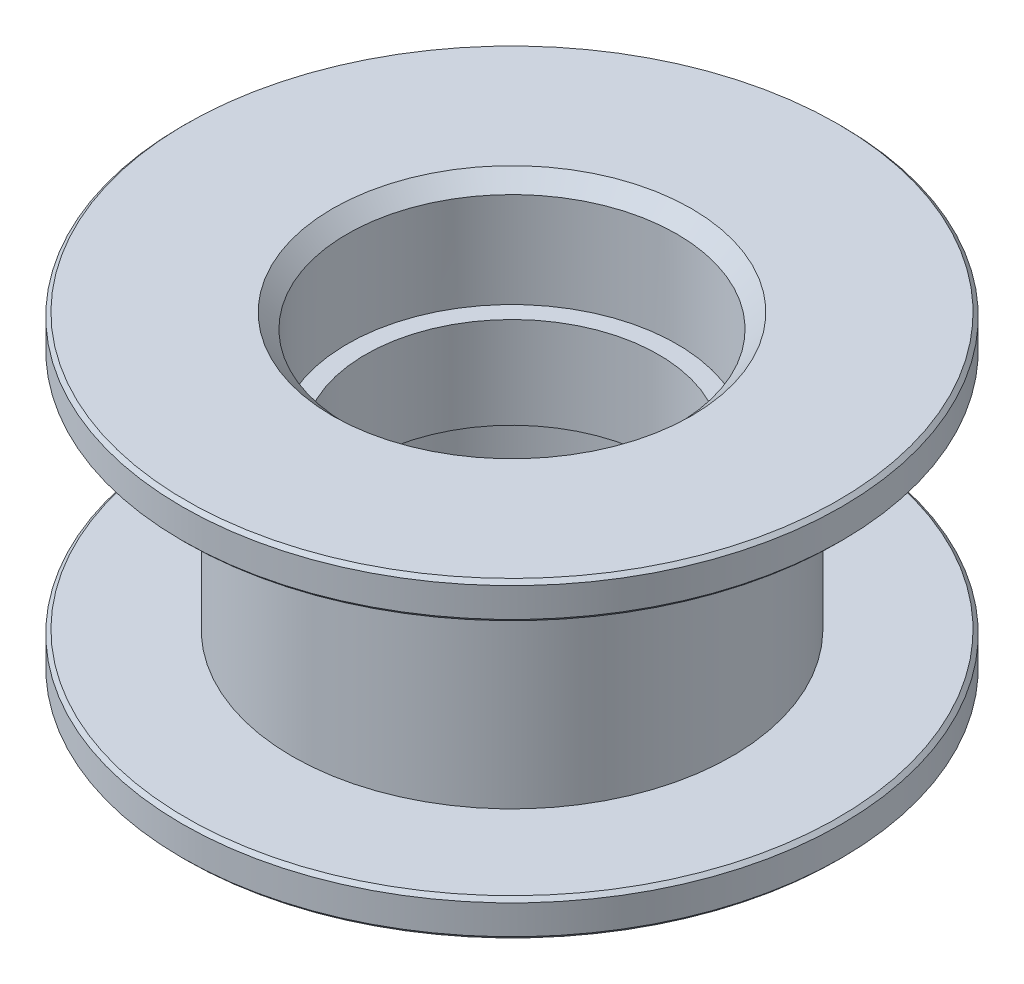
ISO-10303-21;
HEADER;
FILE_DESCRIPTION(('STEP AP214'),'2;1');
FILE_NAME('part.step','',(''),(''),'','','');
FILE_SCHEMA(('AUTOMOTIVE_DESIGN { 1 0 10303 214 1 1 1 1 }'));
ENDSEC;
DATA;
#1=APPLICATION_CONTEXT('core data for automotive mechanical design processes');
#2=APPLICATION_PROTOCOL_DEFINITION('international standard','automotive_design',2000,#1);
#3=PRODUCT_CONTEXT('',#1,'mechanical');
#4=PRODUCT('Part','Part','',(#3));
#5=PRODUCT_RELATED_PRODUCT_CATEGORY('part','',(#4));
#6=PRODUCT_DEFINITION_FORMATION('','',#4);
#7=PRODUCT_DEFINITION_CONTEXT('part definition',#1,'design');
#8=PRODUCT_DEFINITION('design','',#6,#7);
#9=PRODUCT_DEFINITION_SHAPE('','',#8);
#10=(LENGTH_UNIT() NAMED_UNIT(*) SI_UNIT(.MILLI.,.METRE.));
#11=(NAMED_UNIT(*) PLANE_ANGLE_UNIT() SI_UNIT($,.RADIAN.));
#12=(NAMED_UNIT(*) SI_UNIT($,.STERADIAN.) SOLID_ANGLE_UNIT());
#13=UNCERTAINTY_MEASURE_WITH_UNIT(LENGTH_MEASURE(1.E-05),#10,'distance_accuracy_value','');
#14=(GEOMETRIC_REPRESENTATION_CONTEXT(3) GLOBAL_UNCERTAINTY_ASSIGNED_CONTEXT((#13)) GLOBAL_UNIT_ASSIGNED_CONTEXT((#10,
#11,#12)) REPRESENTATION_CONTEXT('',''));
#15=CARTESIAN_POINT('',(0.,0.,0.));
#16=DIRECTION('',(0.,0.,1.));
#17=DIRECTION('',(1.,0.,0.));
#18=AXIS2_PLACEMENT_3D('',#15,#16,#17);
#19=CARTESIAN_POINT('',(9.,-3.25,0.));
#20=DIRECTION('',(0.,-1.,0.));
#21=DIRECTION('',(0.,0.,-1.));
#22=AXIS2_PLACEMENT_3D('',#19,#20,#21);
#23=PLANE('',#22);
#24=CARTESIAN_POINT('',(0.,-3.25,0.));
#25=DIRECTION('',(0.,1.,0.));
#26=DIRECTION('',(0.,0.,1.));
#27=AXIS2_PLACEMENT_3D('',#24,#25,#26);
#28=CIRCLE('',#27,6.);
#29=CARTESIAN_POINT('',(0.,-3.25,6.));
#30=VERTEX_POINT('',#29);
#31=EDGE_CURVE('E140',#30,#30,#28,.T.);
#32=ORIENTED_EDGE('',*,*,#31,.F.);
#33=EDGE_LOOP('',(#32));
#34=FACE_BOUND('',#33,.T.);
#35=CARTESIAN_POINT('',(0.,-3.25,0.));
#36=DIRECTION('',(0.,1.,0.));
#37=DIRECTION('',(0.,0.,-1.));
#38=AXIS2_PLACEMENT_3D('',#35,#36,#37);
#39=CIRCLE('',#38,8.9);
#40=CARTESIAN_POINT('',(0.,-3.25,-8.9));
#41=VERTEX_POINT('',#40);
#42=EDGE_CURVE('E289',#41,#41,#39,.T.);
#43=ORIENTED_EDGE('',*,*,#42,.T.);
#44=EDGE_LOOP('',(#43));
#45=FACE_BOUND('',#44,.T.);
#46=ADVANCED_FACE('F16',(#34,#45),#23,.F.);
#47=CARTESIAN_POINT('',(4.5,-4.25,0.));
#48=DIRECTION('',(0.,1.,0.));
#49=DIRECTION('',(1.,0.,0.));
#50=AXIS2_PLACEMENT_3D('',#47,#48,#49);
#51=PLANE('',#50);
#52=CARTESIAN_POINT('',(0.,-4.25,0.));
#53=DIRECTION('',(0.,1.,0.));
#54=DIRECTION('',(0.,0.,1.));
#55=AXIS2_PLACEMENT_3D('',#52,#53,#54);
#56=CIRCLE('',#55,4.9);
#57=CARTESIAN_POINT('',(0.,-4.25,-4.9));
#58=VERTEX_POINT('',#57);
#59=EDGE_CURVE('E158',#58,#58,#56,.T.);
#60=ORIENTED_EDGE('',*,*,#59,.T.);
#61=EDGE_LOOP('',(#60));
#62=FACE_BOUND('',#61,.T.);
#63=CARTESIAN_POINT('',(0.,-4.25,0.));
#64=DIRECTION('',(0.,-1.,0.));
#65=DIRECTION('',(0.,0.,1.));
#66=AXIS2_PLACEMENT_3D('',#63,#64,#65);
#67=CIRCLE('',#66,8.9);
#68=CARTESIAN_POINT('',(0.,-4.25,8.9));
#69=VERTEX_POINT('',#68);
#70=EDGE_CURVE('E328',#69,#69,#67,.T.);
#71=ORIENTED_EDGE('',*,*,#70,.T.);
#72=EDGE_LOOP('',(#71));
#73=FACE_BOUND('',#72,.T.);
#74=ADVANCED_FACE('F222',(#62,#73),#51,.F.);
#75=CARTESIAN_POINT('',(4.,-1.25,0.));
#76=DIRECTION('',(0.,1.,0.));
#77=DIRECTION('',(1.,0.,0.));
#78=AXIS2_PLACEMENT_3D('',#75,#76,#77);
#79=PLANE('',#78);
#80=CARTESIAN_POINT('',(0.,-1.25,0.));
#81=DIRECTION('',(0.,1.,0.));
#82=DIRECTION('',(0.,0.,-1.));
#83=AXIS2_PLACEMENT_3D('',#80,#81,#82);
#84=CIRCLE('',#83,4.);
#85=CARTESIAN_POINT('',(0.,-1.25,4.));
#86=VERTEX_POINT('',#85);
#87=EDGE_CURVE('E147',#86,#86,#84,.T.);
#88=ORIENTED_EDGE('',*,*,#87,.T.);
#89=EDGE_LOOP('',(#88));
#90=FACE_BOUND('',#89,.T.);
#91=CARTESIAN_POINT('',(0.,-1.25,0.));
#92=DIRECTION('',(0.,1.,0.));
#93=DIRECTION('',(0.,0.,-1.));
#94=AXIS2_PLACEMENT_3D('',#91,#92,#93);
#95=CIRCLE('',#94,4.5);
#96=CARTESIAN_POINT('',(0.,-1.25,4.5));
#97=VERTEX_POINT('',#96);
#98=EDGE_CURVE('E139',#97,#97,#95,.T.);
#99=ORIENTED_EDGE('',*,*,#98,.F.);
#100=EDGE_LOOP('',(#99));
#101=FACE_BOUND('',#100,.T.);
#102=ADVANCED_FACE('F583',(#90,#101),#79,.F.);
#103=CARTESIAN_POINT('',(4.5,1.25,0.));
#104=DIRECTION('',(0.,-1.,0.));
#105=DIRECTION('',(0.,0.,-1.));
#106=AXIS2_PLACEMENT_3D('',#103,#104,#105);
#107=PLANE('',#106);
#108=CARTESIAN_POINT('',(0.,1.25,0.));
#109=DIRECTION('',(0.,1.,0.));
#110=DIRECTION('',(0.,0.,-1.));
#111=AXIS2_PLACEMENT_3D('',#108,#109,#110);
#112=CIRCLE('',#111,4.);
#113=CARTESIAN_POINT('',(0.,1.25,4.));
#114=VERTEX_POINT('',#113);
#115=EDGE_CURVE('E28',#114,#114,#112,.T.);
#116=ORIENTED_EDGE('',*,*,#115,.F.);
#117=EDGE_LOOP('',(#116));
#118=FACE_BOUND('',#117,.T.);
#119=CARTESIAN_POINT('',(0.,1.25,0.));
#120=DIRECTION('',(0.,1.,0.));
#121=DIRECTION('',(0.,0.,-1.));
#122=AXIS2_PLACEMENT_3D('',#119,#120,#121);
#123=CIRCLE('',#122,4.5);
#124=CARTESIAN_POINT('',(0.,1.25,4.5));
#125=VERTEX_POINT('',#124);
#126=EDGE_CURVE('E11',#125,#125,#123,.T.);
#127=ORIENTED_EDGE('',*,*,#126,.T.);
#128=EDGE_LOOP('',(#127));
#129=FACE_BOUND('',#128,.T.);
#130=ADVANCED_FACE('F274',(#118,#129),#107,.F.);
#131=CARTESIAN_POINT('',(9.,4.25,0.));
#132=DIRECTION('',(0.,-1.,0.));
#133=DIRECTION('',(0.,0.,-1.));
#134=AXIS2_PLACEMENT_3D('',#131,#132,#133);
#135=PLANE('',#134);
#136=CARTESIAN_POINT('',(0.,4.25,0.));
#137=DIRECTION('',(0.,-1.,0.));
#138=DIRECTION('',(0.,0.,-1.));
#139=AXIS2_PLACEMENT_3D('',#136,#137,#138);
#140=CIRCLE('',#139,4.9);
#141=CARTESIAN_POINT('',(0.,4.25,4.9));
#142=VERTEX_POINT('',#141);
#143=EDGE_CURVE('E309',#142,#142,#140,.T.);
#144=ORIENTED_EDGE('',*,*,#143,.T.);
#145=EDGE_LOOP('',(#144));
#146=FACE_BOUND('',#145,.T.);
#147=CARTESIAN_POINT('',(0.,4.25,0.));
#148=DIRECTION('',(0.,1.,0.));
#149=DIRECTION('',(0.,0.,-1.));
#150=AXIS2_PLACEMENT_3D('',#147,#148,#149);
#151=CIRCLE('',#150,8.9);
#152=CARTESIAN_POINT('',(0.,4.25,-8.9));
#153=VERTEX_POINT('',#152);
#154=EDGE_CURVE('E165',#153,#153,#151,.T.);
#155=ORIENTED_EDGE('',*,*,#154,.T.);
#156=EDGE_LOOP('',(#155));
#157=FACE_BOUND('',#156,.T.);
#158=ADVANCED_FACE('F567',(#146,#157),#135,.F.);
#159=CARTESIAN_POINT('',(6.,3.25,0.));
#160=DIRECTION('',(0.,1.,0.));
#161=DIRECTION('',(1.,0.,0.));
#162=AXIS2_PLACEMENT_3D('',#159,#160,#161);
#163=PLANE('',#162);
#164=CARTESIAN_POINT('',(0.,3.25,0.));
#165=DIRECTION('',(0.,1.,0.));
#166=DIRECTION('',(0.,0.,1.));
#167=AXIS2_PLACEMENT_3D('',#164,#165,#166);
#168=CIRCLE('',#167,6.);
#169=CARTESIAN_POINT('',(0.,3.25,6.));
#170=VERTEX_POINT('',#169);
#171=EDGE_CURVE('E134',#170,#170,#168,.T.);
#172=ORIENTED_EDGE('',*,*,#171,.T.);
#173=EDGE_LOOP('',(#172));
#174=FACE_BOUND('',#173,.T.);
#175=CARTESIAN_POINT('',(0.,3.25,0.));
#176=DIRECTION('',(0.,-1.,0.));
#177=DIRECTION('',(0.,0.,1.));
#178=AXIS2_PLACEMENT_3D('',#175,#176,#177);
#179=CIRCLE('',#178,8.9);
#180=CARTESIAN_POINT('',(0.,3.25,8.9));
#181=VERTEX_POINT('',#180);
#182=EDGE_CURVE('E297',#181,#181,#179,.T.);
#183=ORIENTED_EDGE('',*,*,#182,.T.);
#184=EDGE_LOOP('',(#183));
#185=FACE_BOUND('',#184,.T.);
#186=ADVANCED_FACE('F135',(#174,#185),#163,.F.);
#187=CARTESIAN_POINT('',(0.,4.25,0.));
#188=DIRECTION('',(0.,1.,0.));
#189=DIRECTION('',(0.,0.,1.));
#190=AXIS2_PLACEMENT_3D('',#187,#188,#189);
#191=CYLINDRICAL_SURFACE('',#190,9.);
#192=CARTESIAN_POINT('',(0.,4.15,0.));
#193=DIRECTION('',(0.,-1.,0.));
#194=DIRECTION('',(0.,0.,1.));
#195=AXIS2_PLACEMENT_3D('',#192,#193,#194);
#196=CIRCLE('',#195,9.);
#197=CARTESIAN_POINT('',(0.,4.15,9.));
#198=VERTEX_POINT('',#197);
#199=CARTESIAN_POINT('',(0.,4.15,-9.));
#200=VERTEX_POINT('',#199);
#201=EDGE_CURVE('E164',#198,#200,#196,.T.);
#202=ORIENTED_EDGE('',*,*,#201,.T.);
#203=CARTESIAN_POINT('',(0.,4.15,0.));
#204=DIRECTION('',(0.,-1.,0.));
#205=DIRECTION('',(0.,0.,-1.));
#206=AXIS2_PLACEMENT_3D('',#203,#204,#205);
#207=CIRCLE('',#206,9.);
#208=EDGE_CURVE('E160',#200,#198,#207,.T.);
#209=ORIENTED_EDGE('',*,*,#208,.T.);
#210=EDGE_LOOP('',(#202,#209));
#211=FACE_BOUND('',#210,.T.);
#212=CARTESIAN_POINT('',(0.,3.35,0.));
#213=DIRECTION('',(0.,1.,0.));
#214=DIRECTION('',(0.,0.,-1.));
#215=AXIS2_PLACEMENT_3D('',#212,#213,#214);
#216=CIRCLE('',#215,9.);
#217=CARTESIAN_POINT('',(0.,3.35,-9.));
#218=VERTEX_POINT('',#217);
#219=CARTESIAN_POINT('',(0.,3.35,9.));
#220=VERTEX_POINT('',#219);
#221=EDGE_CURVE('E286',#218,#220,#216,.T.);
#222=ORIENTED_EDGE('',*,*,#221,.T.);
#223=CARTESIAN_POINT('',(0.,3.35,0.));
#224=DIRECTION('',(0.,1.,0.));
#225=DIRECTION('',(0.,0.,1.));
#226=AXIS2_PLACEMENT_3D('',#223,#224,#225);
#227=CIRCLE('',#226,9.);
#228=EDGE_CURVE('E35',#220,#218,#227,.T.);
#229=ORIENTED_EDGE('',*,*,#228,.T.);
#230=EDGE_LOOP('',(#222,#229));
#231=FACE_BOUND('',#230,.T.);
#232=ADVANCED_FACE('F186',(#211,#231),#191,.T.);
#233=CARTESIAN_POINT('',(0.,4.25,0.));
#234=DIRECTION('',(0.,1.,0.));
#235=DIRECTION('',(0.,0.,1.));
#236=AXIS2_PLACEMENT_3D('',#233,#234,#235);
#237=CYLINDRICAL_SURFACE('',#236,4.5);
#238=CARTESIAN_POINT('',(0.,3.85,0.));
#239=DIRECTION('',(0.,1.,0.));
#240=DIRECTION('',(0.,0.,-1.));
#241=AXIS2_PLACEMENT_3D('',#238,#239,#240);
#242=CIRCLE('',#241,4.5);
#243=CARTESIAN_POINT('',(0.,3.85,-4.5));
#244=VERTEX_POINT('',#243);
#245=CARTESIAN_POINT('',(0.,3.85,4.5));
#246=VERTEX_POINT('',#245);
#247=EDGE_CURVE('E205',#244,#246,#242,.T.);
#248=ORIENTED_EDGE('',*,*,#247,.T.);
#249=CARTESIAN_POINT('',(0.,3.85,0.));
#250=DIRECTION('',(0.,1.,0.));
#251=DIRECTION('',(0.,0.,1.));
#252=AXIS2_PLACEMENT_3D('',#249,#250,#251);
#253=CIRCLE('',#252,4.5);
#254=EDGE_CURVE('E169',#246,#244,#253,.T.);
#255=ORIENTED_EDGE('',*,*,#254,.T.);
#256=EDGE_LOOP('',(#248,#255));
#257=FACE_BOUND('',#256,.T.);
#258=ORIENTED_EDGE('',*,*,#126,.F.);
#259=EDGE_LOOP('',(#258));
#260=FACE_BOUND('',#259,.T.);
#261=ADVANCED_FACE('F176',(#257,#260),#237,.F.);
#262=CARTESIAN_POINT('',(0.,4.25,0.));
#263=DIRECTION('',(0.,1.,0.));
#264=DIRECTION('',(0.,0.,1.));
#265=AXIS2_PLACEMENT_3D('',#262,#263,#264);
#266=CYLINDRICAL_SURFACE('',#265,4.);
#267=ORIENTED_EDGE('',*,*,#115,.T.);
#268=EDGE_LOOP('',(#267));
#269=FACE_BOUND('',#268,.T.);
#270=ORIENTED_EDGE('',*,*,#87,.F.);
#271=EDGE_LOOP('',(#270));
#272=FACE_BOUND('',#271,.T.);
#273=ADVANCED_FACE('F185',(#269,#272),#266,.F.);
#274=CARTESIAN_POINT('',(0.,4.25,0.));
#275=DIRECTION('',(0.,1.,0.));
#276=DIRECTION('',(0.,0.,1.));
#277=AXIS2_PLACEMENT_3D('',#274,#275,#276);
#278=CYLINDRICAL_SURFACE('',#277,4.5);
#279=CARTESIAN_POINT('',(0.,-3.85,0.));
#280=DIRECTION('',(0.,-1.,0.));
#281=DIRECTION('',(0.,0.,1.));
#282=AXIS2_PLACEMENT_3D('',#279,#280,#281);
#283=CIRCLE('',#282,4.5);
#284=CARTESIAN_POINT('',(0.,-3.85,4.5));
#285=VERTEX_POINT('',#284);
#286=CARTESIAN_POINT('',(0.,-3.85,-4.5));
#287=VERTEX_POINT('',#286);
#288=EDGE_CURVE('E149',#285,#287,#283,.T.);
#289=ORIENTED_EDGE('',*,*,#288,.T.);
#290=CARTESIAN_POINT('',(0.,-3.85,0.));
#291=DIRECTION('',(0.,-1.,0.));
#292=DIRECTION('',(0.,0.,-1.));
#293=AXIS2_PLACEMENT_3D('',#290,#291,#292);
#294=CIRCLE('',#293,4.5);
#295=EDGE_CURVE('E155',#287,#285,#294,.T.);
#296=ORIENTED_EDGE('',*,*,#295,.T.);
#297=EDGE_LOOP('',(#289,#296));
#298=FACE_BOUND('',#297,.T.);
#299=ORIENTED_EDGE('',*,*,#98,.T.);
#300=EDGE_LOOP('',(#299));
#301=FACE_BOUND('',#300,.T.);
#302=ADVANCED_FACE('F224',(#298,#301),#278,.F.);
#303=CARTESIAN_POINT('',(0.,4.25,0.));
#304=DIRECTION('',(0.,1.,0.));
#305=DIRECTION('',(0.,0.,1.));
#306=AXIS2_PLACEMENT_3D('',#303,#304,#305);
#307=CYLINDRICAL_SURFACE('',#306,9.);
#308=CARTESIAN_POINT('',(0.,-3.35,0.));
#309=DIRECTION('',(0.,-1.,0.));
#310=DIRECTION('',(0.,0.,1.));
#311=AXIS2_PLACEMENT_3D('',#308,#309,#310);
#312=CIRCLE('',#311,9.);
#313=CARTESIAN_POINT('',(0.,-3.35,9.));
#314=VERTEX_POINT('',#313);
#315=CARTESIAN_POINT('',(0.,-3.35,-9.));
#316=VERTEX_POINT('',#315);
#317=EDGE_CURVE('E325',#314,#316,#312,.T.);
#318=ORIENTED_EDGE('',*,*,#317,.T.);
#319=CARTESIAN_POINT('',(0.,-3.35,0.));
#320=DIRECTION('',(0.,-1.,0.));
#321=DIRECTION('',(0.,0.,-1.));
#322=AXIS2_PLACEMENT_3D('',#319,#320,#321);
#323=CIRCLE('',#322,9.);
#324=EDGE_CURVE('E294',#316,#314,#323,.T.);
#325=ORIENTED_EDGE('',*,*,#324,.T.);
#326=EDGE_LOOP('',(#318,#325));
#327=FACE_BOUND('',#326,.T.);
#328=CARTESIAN_POINT('',(0.,-4.15,0.));
#329=DIRECTION('',(0.,1.,0.));
#330=DIRECTION('',(0.,0.,-1.));
#331=AXIS2_PLACEMENT_3D('',#328,#329,#330);
#332=CIRCLE('',#331,9.);
#333=CARTESIAN_POINT('',(0.,-4.15,-9.));
#334=VERTEX_POINT('',#333);
#335=CARTESIAN_POINT('',(0.,-4.15,9.));
#336=VERTEX_POINT('',#335);
#337=EDGE_CURVE('E337',#334,#336,#332,.T.);
#338=ORIENTED_EDGE('',*,*,#337,.T.);
#339=CARTESIAN_POINT('',(0.,-4.15,0.));
#340=DIRECTION('',(0.,1.,0.));
#341=DIRECTION('',(0.,0.,1.));
#342=AXIS2_PLACEMENT_3D('',#339,#340,#341);
#343=CIRCLE('',#342,9.);
#344=EDGE_CURVE('E43',#336,#334,#343,.T.);
#345=ORIENTED_EDGE('',*,*,#344,.T.);
#346=EDGE_LOOP('',(#338,#345));
#347=FACE_BOUND('',#346,.T.);
#348=ADVANCED_FACE('F235',(#327,#347),#307,.T.);
#349=CARTESIAN_POINT('',(0.,4.25,0.));
#350=DIRECTION('',(0.,1.,0.));
#351=DIRECTION('',(0.,0.,1.));
#352=AXIS2_PLACEMENT_3D('',#349,#350,#351);
#353=CYLINDRICAL_SURFACE('',#352,6.);
#354=ORIENTED_EDGE('',*,*,#171,.F.);
#355=EDGE_LOOP('',(#354));
#356=FACE_BOUND('',#355,.T.);
#357=ORIENTED_EDGE('',*,*,#31,.T.);
#358=EDGE_LOOP('',(#357));
#359=FACE_BOUND('',#358,.T.);
#360=ADVANCED_FACE('F513',(#356,#359),#353,.T.);
#361=CARTESIAN_POINT('',(0.,-4.05,0.));
#362=DIRECTION('',(0.,-1.,0.));
#363=DIRECTION('',(0.,0.,-1.));
#364=AXIS2_PLACEMENT_3D('',#361,#362,#363);
#365=CONICAL_SURFACE('',#364,4.7,0.785398163397444);
#366=ORIENTED_EDGE('',*,*,#295,.F.);
#367=ORIENTED_EDGE('',*,*,#288,.F.);
#368=EDGE_LOOP('',(#366,#367));
#369=FACE_BOUND('',#368,.T.);
#370=ORIENTED_EDGE('',*,*,#59,.F.);
#371=EDGE_LOOP('',(#370));
#372=FACE_BOUND('',#371,.T.);
#373=ADVANCED_FACE('F187',(#369,#372),#365,.F.);
#374=CARTESIAN_POINT('',(0.,4.05,0.));
#375=DIRECTION('',(0.,1.,0.));
#376=DIRECTION('',(0.,0.,-1.));
#377=AXIS2_PLACEMENT_3D('',#374,#375,#376);
#378=CONICAL_SURFACE('',#377,4.7,0.785398163397453);
#379=ORIENTED_EDGE('',*,*,#143,.F.);
#380=EDGE_LOOP('',(#379));
#381=FACE_BOUND('',#380,.T.);
#382=ORIENTED_EDGE('',*,*,#247,.F.);
#383=ORIENTED_EDGE('',*,*,#254,.F.);
#384=EDGE_LOOP('',(#382,#383));
#385=FACE_BOUND('',#384,.T.);
#386=ADVANCED_FACE('F210',(#381,#385),#378,.F.);
#387=CARTESIAN_POINT('',(0.,-4.2,0.));
#388=DIRECTION('',(0.,1.,0.));
#389=DIRECTION('',(0.,0.,-1.));
#390=AXIS2_PLACEMENT_3D('',#387,#388,#389);
#391=CONICAL_SURFACE('',#390,8.95,0.785398163397448);
#392=ORIENTED_EDGE('',*,*,#337,.F.);
#393=ORIENTED_EDGE('',*,*,#344,.F.);
#394=EDGE_LOOP('',(#392,#393));
#395=FACE_BOUND('',#394,.T.);
#396=ORIENTED_EDGE('',*,*,#70,.F.);
#397=EDGE_LOOP('',(#396));
#398=FACE_BOUND('',#397,.T.);
#399=ADVANCED_FACE('F220',(#395,#398),#391,.T.);
#400=CARTESIAN_POINT('',(0.,-3.3,0.));
#401=DIRECTION('',(0.,-1.,0.));
#402=DIRECTION('',(0.,0.,-1.));
#403=AXIS2_PLACEMENT_3D('',#400,#401,#402);
#404=CONICAL_SURFACE('',#403,8.95,0.785398163397448);
#405=ORIENTED_EDGE('',*,*,#324,.F.);
#406=ORIENTED_EDGE('',*,*,#317,.F.);
#407=EDGE_LOOP('',(#405,#406));
#408=FACE_BOUND('',#407,.T.);
#409=ORIENTED_EDGE('',*,*,#42,.F.);
#410=EDGE_LOOP('',(#409));
#411=FACE_BOUND('',#410,.T.);
#412=ADVANCED_FACE('F18',(#408,#411),#404,.T.);
#413=CARTESIAN_POINT('',(0.,3.3,0.));
#414=DIRECTION('',(0.,1.,0.));
#415=DIRECTION('',(0.,0.,-1.));
#416=AXIS2_PLACEMENT_3D('',#413,#414,#415);
#417=CONICAL_SURFACE('',#416,8.95,0.785398163397457);
#418=ORIENTED_EDGE('',*,*,#221,.F.);
#419=ORIENTED_EDGE('',*,*,#228,.F.);
#420=EDGE_LOOP('',(#418,#419));
#421=FACE_BOUND('',#420,.T.);
#422=ORIENTED_EDGE('',*,*,#182,.F.);
#423=EDGE_LOOP('',(#422));
#424=FACE_BOUND('',#423,.T.);
#425=ADVANCED_FACE('F189',(#421,#424),#417,.T.);
#426=CARTESIAN_POINT('',(0.,4.2,0.));
#427=DIRECTION('',(0.,-1.,0.));
#428=DIRECTION('',(0.,0.,-1.));
#429=AXIS2_PLACEMENT_3D('',#426,#427,#428);
#430=CONICAL_SURFACE('',#429,8.95,0.785398163397448);
#431=ORIENTED_EDGE('',*,*,#208,.F.);
#432=ORIENTED_EDGE('',*,*,#201,.F.);
#433=EDGE_LOOP('',(#431,#432));
#434=FACE_BOUND('',#433,.T.);
#435=ORIENTED_EDGE('',*,*,#154,.F.);
#436=EDGE_LOOP('',(#435));
#437=FACE_BOUND('',#436,.T.);
#438=ADVANCED_FACE('F446',(#434,#437),#430,.T.);
#439=CLOSED_SHELL('',(#46,#74,#102,#130,#158,#186,#232,#261,#273,#302,#348,#360,#373,#386,#399,
#412,#425,#438));
#440=MANIFOLD_SOLID_BREP('B1',#439);
#441=ADVANCED_BREP_SHAPE_REPRESENTATION('',(#18,#440),#14);
#442=SHAPE_DEFINITION_REPRESENTATION(#9,#441);
ENDSEC;
END-ISO-10303-21;
